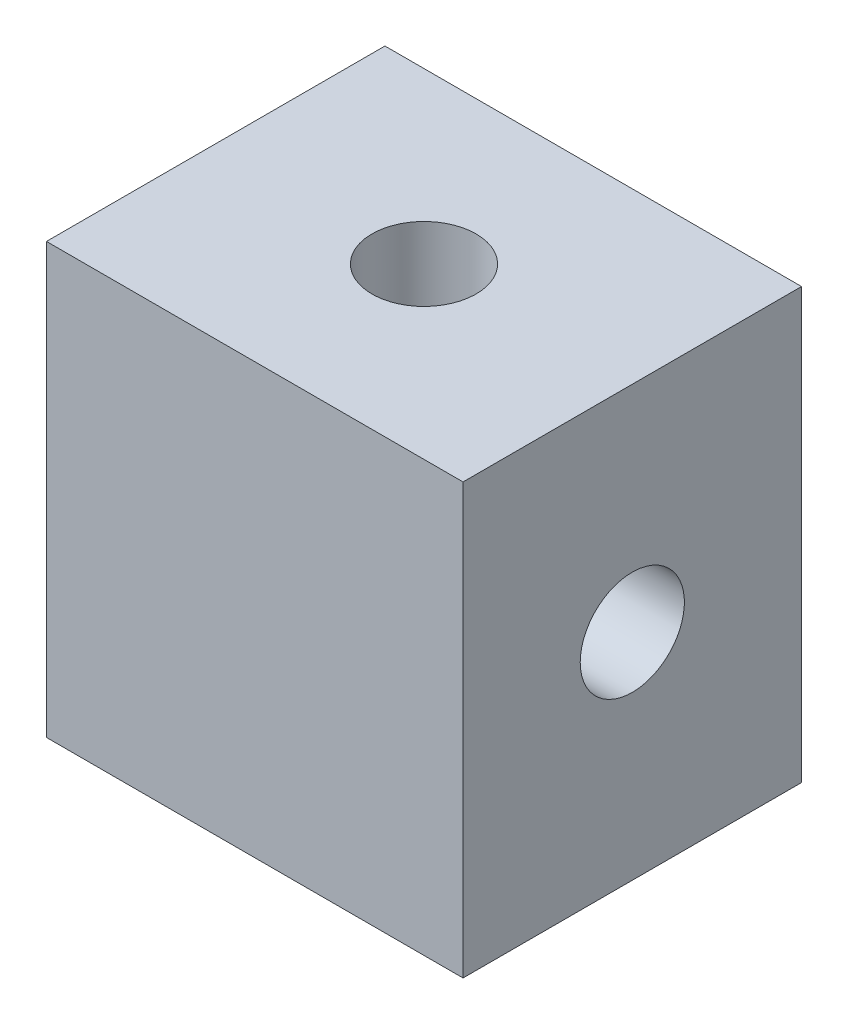
ISO-10303-21;
HEADER;
FILE_DESCRIPTION(('STEP AP214'),'2;1');
FILE_NAME('part.step','',(''),(''),'','','');
FILE_SCHEMA(('AUTOMOTIVE_DESIGN { 1 0 10303 214 1 1 1 1 }'));
ENDSEC;
DATA;
#1=APPLICATION_CONTEXT('core data for automotive mechanical design processes');
#2=APPLICATION_PROTOCOL_DEFINITION('international standard','automotive_design',2000,#1);
#3=PRODUCT_CONTEXT('',#1,'mechanical');
#4=PRODUCT('Part','Part','',(#3));
#5=PRODUCT_RELATED_PRODUCT_CATEGORY('part','',(#4));
#6=PRODUCT_DEFINITION_FORMATION('','',#4);
#7=PRODUCT_DEFINITION_CONTEXT('part definition',#1,'design');
#8=PRODUCT_DEFINITION('design','',#6,#7);
#9=PRODUCT_DEFINITION_SHAPE('','',#8);
#10=(LENGTH_UNIT() NAMED_UNIT(*) SI_UNIT(.MILLI.,.METRE.));
#11=(NAMED_UNIT(*) PLANE_ANGLE_UNIT() SI_UNIT($,.RADIAN.));
#12=(NAMED_UNIT(*) SI_UNIT($,.STERADIAN.) SOLID_ANGLE_UNIT());
#13=UNCERTAINTY_MEASURE_WITH_UNIT(LENGTH_MEASURE(1.E-05),#10,'distance_accuracy_value','');
#14=(GEOMETRIC_REPRESENTATION_CONTEXT(3) GLOBAL_UNCERTAINTY_ASSIGNED_CONTEXT((#13)) GLOBAL_UNIT_ASSIGNED_CONTEXT((#10,
#11,#12)) REPRESENTATION_CONTEXT('',''));
#15=CARTESIAN_POINT('',(0.,0.,0.));
#16=DIRECTION('',(0.,0.,1.));
#17=DIRECTION('',(1.,0.,0.));
#18=AXIS2_PLACEMENT_3D('',#15,#16,#17);
#19=CARTESIAN_POINT('',(0.,20.,0.));
#20=DIRECTION('',(0.,-1.,0.));
#21=DIRECTION('',(0.,0.,-1.));
#22=AXIS2_PLACEMENT_3D('',#19,#20,#21);
#23=CYLINDRICAL_SURFACE('',#22,4.);
#24=CARTESIAN_POINT('',(0.,-16.5,0.));
#25=DIRECTION('',(0.,1.,0.));
#26=DIRECTION('',(0.,0.,1.));
#27=AXIS2_PLACEMENT_3D('',#24,#25,#26);
#28=CIRCLE('',#27,4.);
#29=CARTESIAN_POINT('',(0.,-16.5,4.));
#30=VERTEX_POINT('',#29);
#31=EDGE_CURVE('E115',#30,#30,#28,.F.);
#32=ORIENTED_EDGE('',*,*,#31,.T.);
#33=EDGE_LOOP('',(#32));
#34=FACE_BOUND('',#33,.T.);
#35=CARTESIAN_POINT('',(0.,0.,0.));
#36=DIRECTION('',(0.707106781186547,-0.707106781186547,0.));
#37=DIRECTION('',(-0.707106781186547,-0.707106781186547,0.));
#38=AXIS2_PLACEMENT_3D('',#35,#36,#37);
#39=ELLIPSE('',#38,5.65685424949238,4.);
#40=CARTESIAN_POINT('',(0.,0.,-4.));
#41=VERTEX_POINT('',#40);
#42=CARTESIAN_POINT('',(0.,0.,4.));
#43=VERTEX_POINT('',#42);
#44=EDGE_CURVE('E55',#41,#43,#39,.F.);
#45=ORIENTED_EDGE('',*,*,#44,.T.);
#46=CARTESIAN_POINT('',(0.,0.,0.));
#47=DIRECTION('',(-0.707106781186547,-0.707106781186547,0.));
#48=DIRECTION('',(0.707106781186547,-0.707106781186547,0.));
#49=AXIS2_PLACEMENT_3D('',#46,#47,#48);
#50=ELLIPSE('',#49,5.65685424949238,4.);
#51=EDGE_CURVE('E11',#43,#41,#50,.F.);
#52=ORIENTED_EDGE('',*,*,#51,.T.);
#53=EDGE_LOOP('',(#45,#52));
#54=FACE_BOUND('',#53,.T.);
#55=ADVANCED_FACE('F39',(#34,#54),#23,.F.);
#56=CARTESIAN_POINT('',(0.,16.5,0.));
#57=DIRECTION('',(0.,-1.,0.));
#58=DIRECTION('',(0.,0.,-1.));
#59=AXIS2_PLACEMENT_3D('',#56,#57,#58);
#60=CIRCLE('',#59,4.);
#61=CARTESIAN_POINT('',(0.,16.5,-4.));
#62=VERTEX_POINT('',#61);
#63=EDGE_CURVE('E108',#62,#62,#60,.F.);
#64=ORIENTED_EDGE('',*,*,#63,.T.);
#65=EDGE_LOOP('',(#64));
#66=FACE_BOUND('',#65,.T.);
#67=CARTESIAN_POINT('',(0.,0.,0.));
#68=DIRECTION('',(0.707106781186547,-0.707106781186547,0.));
#69=DIRECTION('',(-0.707106781186547,-0.707106781186547,0.));
#70=AXIS2_PLACEMENT_3D('',#67,#68,#69);
#71=ELLIPSE('',#70,5.65685424949238,4.);
#72=EDGE_CURVE('E96',#41,#43,#71,.T.);
#73=ORIENTED_EDGE('',*,*,#72,.T.);
#74=CARTESIAN_POINT('',(0.,0.,0.));
#75=DIRECTION('',(-0.707106781186547,-0.707106781186547,0.));
#76=DIRECTION('',(0.707106781186547,-0.707106781186547,0.));
#77=AXIS2_PLACEMENT_3D('',#74,#75,#76);
#78=ELLIPSE('',#77,5.65685424949238,4.);
#79=EDGE_CURVE('E50',#43,#41,#78,.T.);
#80=ORIENTED_EDGE('',*,*,#79,.T.);
#81=EDGE_LOOP('',(#73,#80));
#82=FACE_BOUND('',#81,.T.);
#83=ADVANCED_FACE('F110',(#66,#82),#23,.F.);
#84=CARTESIAN_POINT('',(-16.,16.5,13.));
#85=DIRECTION('',(1.,0.,0.));
#86=DIRECTION('',(0.,0.,-1.));
#87=AXIS2_PLACEMENT_3D('',#84,#85,#86);
#88=PLANE('',#87);
#89=CARTESIAN_POINT('',(-16.,0.,0.));
#90=DIRECTION('',(1.,0.,0.));
#91=DIRECTION('',(0.,0.,-1.));
#92=AXIS2_PLACEMENT_3D('',#89,#90,#91);
#93=CIRCLE('',#92,4.);
#94=CARTESIAN_POINT('',(-16.,0.,-4.));
#95=VERTEX_POINT('',#94);
#96=EDGE_CURVE('E114',#95,#95,#93,.F.);
#97=ORIENTED_EDGE('',*,*,#96,.F.);
#98=EDGE_LOOP('',(#97));
#99=FACE_BOUND('',#98,.T.);
#100=DIRECTION('',(0.,-1.,0.));
#101=VECTOR('',#100,1.);
#102=CARTESIAN_POINT('',(-16.,16.5,-13.));
#103=LINE('',#102,#101);
#104=CARTESIAN_POINT('',(-16.,16.5,-13.));
#105=VERTEX_POINT('',#104);
#106=CARTESIAN_POINT('',(-16.,-16.5,-13.));
#107=VERTEX_POINT('',#106);
#108=EDGE_CURVE('E126',#105,#107,#103,.T.);
#109=ORIENTED_EDGE('',*,*,#108,.T.);
#110=DIRECTION('',(0.,0.,-1.));
#111=VECTOR('',#110,1.);
#112=CARTESIAN_POINT('',(-16.,-16.5,13.));
#113=LINE('',#112,#111);
#114=CARTESIAN_POINT('',(-16.,-16.5,13.));
#115=VERTEX_POINT('',#114);
#116=EDGE_CURVE('E104',#115,#107,#113,.T.);
#117=ORIENTED_EDGE('',*,*,#116,.F.);
#118=DIRECTION('',(0.,-1.,0.));
#119=VECTOR('',#118,1.);
#120=CARTESIAN_POINT('',(-16.,16.5,13.));
#121=LINE('',#120,#119);
#122=CARTESIAN_POINT('',(-16.,16.5,13.));
#123=VERTEX_POINT('',#122);
#124=EDGE_CURVE('E122',#123,#115,#121,.T.);
#125=ORIENTED_EDGE('',*,*,#124,.F.);
#126=DIRECTION('',(0.,0.,-1.));
#127=VECTOR('',#126,1.);
#128=CARTESIAN_POINT('',(-16.,16.5,13.));
#129=LINE('',#128,#127);
#130=EDGE_CURVE('E117',#123,#105,#129,.T.);
#131=ORIENTED_EDGE('',*,*,#130,.T.);
#132=EDGE_LOOP('',(#109,#117,#125,#131));
#133=FACE_BOUND('',#132,.T.);
#134=ADVANCED_FACE('F41',(#99,#133),#88,.F.);
#135=CARTESIAN_POINT('',(-16.,-16.5,13.));
#136=DIRECTION('',(0.,1.,0.));
#137=DIRECTION('',(0.,0.,1.));
#138=AXIS2_PLACEMENT_3D('',#135,#136,#137);
#139=PLANE('',#138);
#140=ORIENTED_EDGE('',*,*,#31,.F.);
#141=EDGE_LOOP('',(#140));
#142=FACE_BOUND('',#141,.T.);
#143=DIRECTION('',(1.,0.,0.));
#144=VECTOR('',#143,1.);
#145=CARTESIAN_POINT('',(-16.,-16.5,-13.));
#146=LINE('',#145,#144);
#147=CARTESIAN_POINT('',(16.,-16.5,-13.));
#148=VERTEX_POINT('',#147);
#149=EDGE_CURVE('E127',#107,#148,#146,.T.);
#150=ORIENTED_EDGE('',*,*,#149,.T.);
#151=DIRECTION('',(0.,0.,-1.));
#152=VECTOR('',#151,1.);
#153=CARTESIAN_POINT('',(16.,-16.5,13.));
#154=LINE('',#153,#152);
#155=CARTESIAN_POINT('',(16.,-16.5,13.));
#156=VERTEX_POINT('',#155);
#157=EDGE_CURVE('E113',#156,#148,#154,.T.);
#158=ORIENTED_EDGE('',*,*,#157,.F.);
#159=DIRECTION('',(1.,0.,0.));
#160=VECTOR('',#159,1.);
#161=CARTESIAN_POINT('',(-16.,-16.5,13.));
#162=LINE('',#161,#160);
#163=EDGE_CURVE('E89',#115,#156,#162,.T.);
#164=ORIENTED_EDGE('',*,*,#163,.F.);
#165=ORIENTED_EDGE('',*,*,#116,.T.);
#166=EDGE_LOOP('',(#150,#158,#164,#165));
#167=FACE_BOUND('',#166,.T.);
#168=ADVANCED_FACE('F146',(#142,#167),#139,.F.);
#169=CARTESIAN_POINT('',(16.,-16.5,13.));
#170=DIRECTION('',(-1.,0.,0.));
#171=DIRECTION('',(0.,0.,1.));
#172=AXIS2_PLACEMENT_3D('',#169,#170,#171);
#173=PLANE('',#172);
#174=CARTESIAN_POINT('',(16.,0.,0.));
#175=DIRECTION('',(-1.,0.,0.));
#176=DIRECTION('',(0.,0.,1.));
#177=AXIS2_PLACEMENT_3D('',#174,#175,#176);
#178=CIRCLE('',#177,4.);
#179=CARTESIAN_POINT('',(16.,0.,4.));
#180=VERTEX_POINT('',#179);
#181=EDGE_CURVE('E139',#180,#180,#178,.F.);
#182=ORIENTED_EDGE('',*,*,#181,.F.);
#183=EDGE_LOOP('',(#182));
#184=FACE_BOUND('',#183,.T.);
#185=DIRECTION('',(0.,1.,0.));
#186=VECTOR('',#185,1.);
#187=CARTESIAN_POINT('',(16.,-16.5,-13.));
#188=LINE('',#187,#186);
#189=CARTESIAN_POINT('',(16.,16.5,-13.));
#190=VERTEX_POINT('',#189);
#191=EDGE_CURVE('E123',#148,#190,#188,.T.);
#192=ORIENTED_EDGE('',*,*,#191,.T.);
#193=DIRECTION('',(0.,0.,-1.));
#194=VECTOR('',#193,1.);
#195=CARTESIAN_POINT('',(16.,16.5,13.));
#196=LINE('',#195,#194);
#197=CARTESIAN_POINT('',(16.,16.5,13.));
#198=VERTEX_POINT('',#197);
#199=EDGE_CURVE('E120',#198,#190,#196,.T.);
#200=ORIENTED_EDGE('',*,*,#199,.F.);
#201=DIRECTION('',(0.,1.,0.));
#202=VECTOR('',#201,1.);
#203=CARTESIAN_POINT('',(16.,-16.5,13.));
#204=LINE('',#203,#202);
#205=EDGE_CURVE('E131',#156,#198,#204,.T.);
#206=ORIENTED_EDGE('',*,*,#205,.F.);
#207=ORIENTED_EDGE('',*,*,#157,.T.);
#208=EDGE_LOOP('',(#192,#200,#206,#207));
#209=FACE_BOUND('',#208,.T.);
#210=ADVANCED_FACE('F145',(#184,#209),#173,.F.);
#211=CARTESIAN_POINT('',(16.,16.5,13.));
#212=DIRECTION('',(0.,-1.,0.));
#213=DIRECTION('',(0.,0.,-1.));
#214=AXIS2_PLACEMENT_3D('',#211,#212,#213);
#215=PLANE('',#214);
#216=ORIENTED_EDGE('',*,*,#63,.F.);
#217=EDGE_LOOP('',(#216));
#218=FACE_BOUND('',#217,.T.);
#219=DIRECTION('',(-1.,0.,0.));
#220=VECTOR('',#219,1.);
#221=CARTESIAN_POINT('',(16.,16.5,-13.));
#222=LINE('',#221,#220);
#223=EDGE_CURVE('E85',#190,#105,#222,.T.);
#224=ORIENTED_EDGE('',*,*,#223,.T.);
#225=ORIENTED_EDGE('',*,*,#130,.F.);
#226=DIRECTION('',(-1.,0.,0.));
#227=VECTOR('',#226,1.);
#228=CARTESIAN_POINT('',(16.,16.5,13.));
#229=LINE('',#228,#227);
#230=EDGE_CURVE('E64',#198,#123,#229,.T.);
#231=ORIENTED_EDGE('',*,*,#230,.F.);
#232=ORIENTED_EDGE('',*,*,#199,.T.);
#233=EDGE_LOOP('',(#224,#225,#231,#232));
#234=FACE_BOUND('',#233,.T.);
#235=ADVANCED_FACE('F150',(#218,#234),#215,.F.);
#236=CARTESIAN_POINT('',(0.,0.,13.));
#237=DIRECTION('',(0.,0.,1.));
#238=DIRECTION('',(1.,0.,0.));
#239=AXIS2_PLACEMENT_3D('',#236,#237,#238);
#240=PLANE('',#239);
#241=ORIENTED_EDGE('',*,*,#124,.T.);
#242=ORIENTED_EDGE('',*,*,#163,.T.);
#243=ORIENTED_EDGE('',*,*,#205,.T.);
#244=ORIENTED_EDGE('',*,*,#230,.T.);
#245=EDGE_LOOP('',(#241,#242,#243,#244));
#246=FACE_BOUND('',#245,.T.);
#247=ADVANCED_FACE('F157',(#246),#240,.T.);
#248=CARTESIAN_POINT('',(0.,0.,-13.));
#249=DIRECTION('',(0.,0.,1.));
#250=DIRECTION('',(1.,0.,0.));
#251=AXIS2_PLACEMENT_3D('',#248,#249,#250);
#252=PLANE('',#251);
#253=ORIENTED_EDGE('',*,*,#108,.F.);
#254=ORIENTED_EDGE('',*,*,#223,.F.);
#255=ORIENTED_EDGE('',*,*,#191,.F.);
#256=ORIENTED_EDGE('',*,*,#149,.F.);
#257=EDGE_LOOP('',(#253,#254,#255,#256));
#258=FACE_BOUND('',#257,.T.);
#259=ADVANCED_FACE('F154',(#258),#252,.F.);
#260=CARTESIAN_POINT('',(20.,0.,0.));
#261=DIRECTION('',(-1.,0.,0.));
#262=DIRECTION('',(0.,0.,1.));
#263=AXIS2_PLACEMENT_3D('',#260,#261,#262);
#264=CYLINDRICAL_SURFACE('',#263,4.);
#265=ORIENTED_EDGE('',*,*,#44,.F.);
#266=ORIENTED_EDGE('',*,*,#79,.F.);
#267=EDGE_LOOP('',(#265,#266));
#268=FACE_BOUND('',#267,.T.);
#269=ORIENTED_EDGE('',*,*,#96,.T.);
#270=EDGE_LOOP('',(#269));
#271=FACE_BOUND('',#270,.T.);
#272=ADVANCED_FACE('F103',(#268,#271),#264,.F.);
#273=ORIENTED_EDGE('',*,*,#72,.F.);
#274=ORIENTED_EDGE('',*,*,#51,.F.);
#275=EDGE_LOOP('',(#273,#274));
#276=FACE_BOUND('',#275,.T.);
#277=ORIENTED_EDGE('',*,*,#181,.T.);
#278=EDGE_LOOP('',(#277));
#279=FACE_BOUND('',#278,.T.);
#280=ADVANCED_FACE('F100',(#276,#279),#264,.F.);
#281=CLOSED_SHELL('',(#55,#83,#134,#168,#210,#235,#247,#259,#272,#280));
#282=MANIFOLD_SOLID_BREP('B2',#281);
#283=ADVANCED_BREP_SHAPE_REPRESENTATION('',(#18,#282),#14);
#284=SHAPE_DEFINITION_REPRESENTATION(#9,#283);
ENDSEC;
END-ISO-10303-21;
